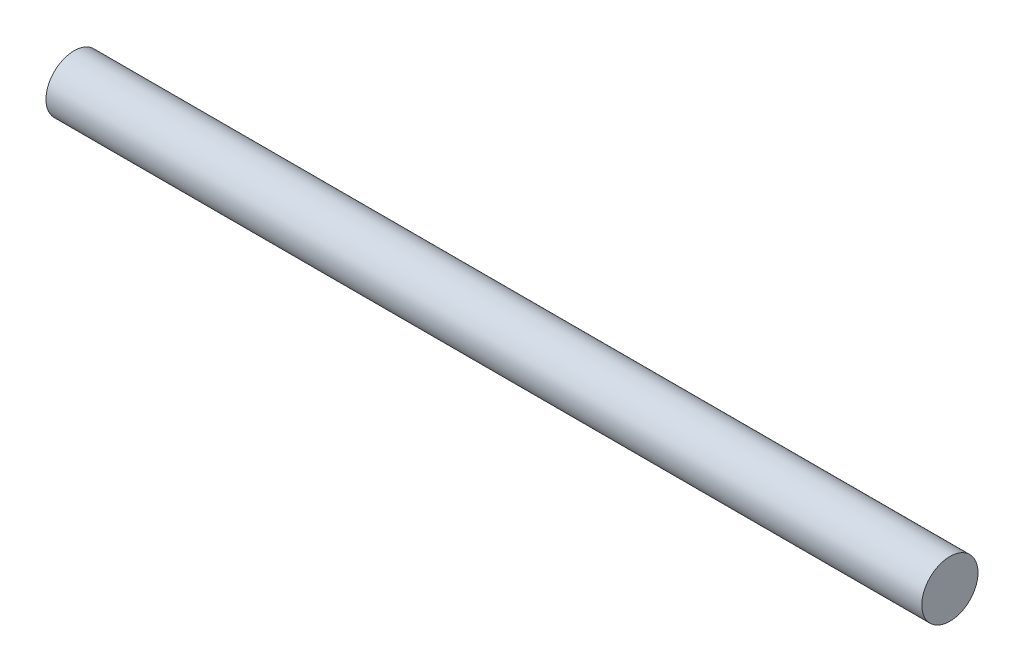
ISO-10303-21;
HEADER;
FILE_DESCRIPTION(('STEP AP214'),'2;1');
FILE_NAME('part.step','',(''),(''),'','','');
FILE_SCHEMA(('AUTOMOTIVE_DESIGN { 1 0 10303 214 1 1 1 1 }'));
ENDSEC;
DATA;
#1=APPLICATION_CONTEXT('core data for automotive mechanical design processes');
#2=APPLICATION_PROTOCOL_DEFINITION('international standard','automotive_design',2000,#1);
#3=PRODUCT_CONTEXT('',#1,'mechanical');
#4=PRODUCT('Part','Part','',(#3));
#5=PRODUCT_RELATED_PRODUCT_CATEGORY('part','',(#4));
#6=PRODUCT_DEFINITION_FORMATION('','',#4);
#7=PRODUCT_DEFINITION_CONTEXT('part definition',#1,'design');
#8=PRODUCT_DEFINITION('design','',#6,#7);
#9=PRODUCT_DEFINITION_SHAPE('','',#8);
#10=(LENGTH_UNIT() NAMED_UNIT(*) SI_UNIT(.MILLI.,.METRE.));
#11=(NAMED_UNIT(*) PLANE_ANGLE_UNIT() SI_UNIT($,.RADIAN.));
#12=(NAMED_UNIT(*) SI_UNIT($,.STERADIAN.) SOLID_ANGLE_UNIT());
#13=UNCERTAINTY_MEASURE_WITH_UNIT(LENGTH_MEASURE(1.E-05),#10,'distance_accuracy_value','');
#14=(GEOMETRIC_REPRESENTATION_CONTEXT(3) GLOBAL_UNCERTAINTY_ASSIGNED_CONTEXT((#13)) GLOBAL_UNIT_ASSIGNED_CONTEXT((#10,
#11,#12)) REPRESENTATION_CONTEXT('',''));
#15=CARTESIAN_POINT('',(0.,0.,0.));
#16=DIRECTION('',(0.,0.,1.));
#17=DIRECTION('',(1.,0.,0.));
#18=AXIS2_PLACEMENT_3D('',#15,#16,#17);
#19=CARTESIAN_POINT('',(74.8,0.,0.));
#20=DIRECTION('',(-1.,0.,0.));
#21=DIRECTION('',(0.,0.,1.));
#22=AXIS2_PLACEMENT_3D('',#19,#20,#21);
#23=CYLINDRICAL_SURFACE('',#22,2.4);
#24=CARTESIAN_POINT('',(74.8,0.,0.));
#25=DIRECTION('',(1.,0.,0.));
#26=DIRECTION('',(0.,0.,-1.));
#27=AXIS2_PLACEMENT_3D('',#24,#25,#26);
#28=CIRCLE('',#27,2.4);
#29=CARTESIAN_POINT('',(74.8,0.,-2.4));
#30=VERTEX_POINT('',#29);
#31=EDGE_CURVE('E11',#30,#30,#28,.T.);
#32=ORIENTED_EDGE('',*,*,#31,.F.);
#33=EDGE_LOOP('',(#32));
#34=FACE_BOUND('',#33,.T.);
#35=CARTESIAN_POINT('',(0.,0.,0.));
#36=DIRECTION('',(1.,0.,0.));
#37=DIRECTION('',(0.,0.,-1.));
#38=AXIS2_PLACEMENT_3D('',#35,#36,#37);
#39=CIRCLE('',#38,2.4);
#40=CARTESIAN_POINT('',(0.,0.,-2.4));
#41=VERTEX_POINT('',#40);
#42=EDGE_CURVE('E41',#41,#41,#39,.T.);
#43=ORIENTED_EDGE('',*,*,#42,.T.);
#44=EDGE_LOOP('',(#43));
#45=FACE_BOUND('',#44,.T.);
#46=ADVANCED_FACE('F38',(#34,#45),#23,.T.);
#47=CARTESIAN_POINT('',(74.8,0.,0.));
#48=DIRECTION('',(1.,0.,0.));
#49=DIRECTION('',(0.,0.,-1.));
#50=AXIS2_PLACEMENT_3D('',#47,#48,#49);
#51=PLANE('',#50);
#52=ORIENTED_EDGE('',*,*,#31,.T.);
#53=EDGE_LOOP('',(#52));
#54=FACE_BOUND('',#53,.T.);
#55=ADVANCED_FACE('F53',(#54),#51,.T.);
#56=CARTESIAN_POINT('',(0.,0.,0.));
#57=DIRECTION('',(1.,0.,0.));
#58=DIRECTION('',(0.,0.,-1.));
#59=AXIS2_PLACEMENT_3D('',#56,#57,#58);
#60=PLANE('',#59);
#61=ORIENTED_EDGE('',*,*,#42,.F.);
#62=EDGE_LOOP('',(#61));
#63=FACE_BOUND('',#62,.T.);
#64=ADVANCED_FACE('F51',(#63),#60,.F.);
#65=CLOSED_SHELL('',(#46,#55,#64));
#66=MANIFOLD_SOLID_BREP('B2',#65);
#67=ADVANCED_BREP_SHAPE_REPRESENTATION('',(#18,#66),#14);
#68=SHAPE_DEFINITION_REPRESENTATION(#9,#67);
ENDSEC;
END-ISO-10303-21;
